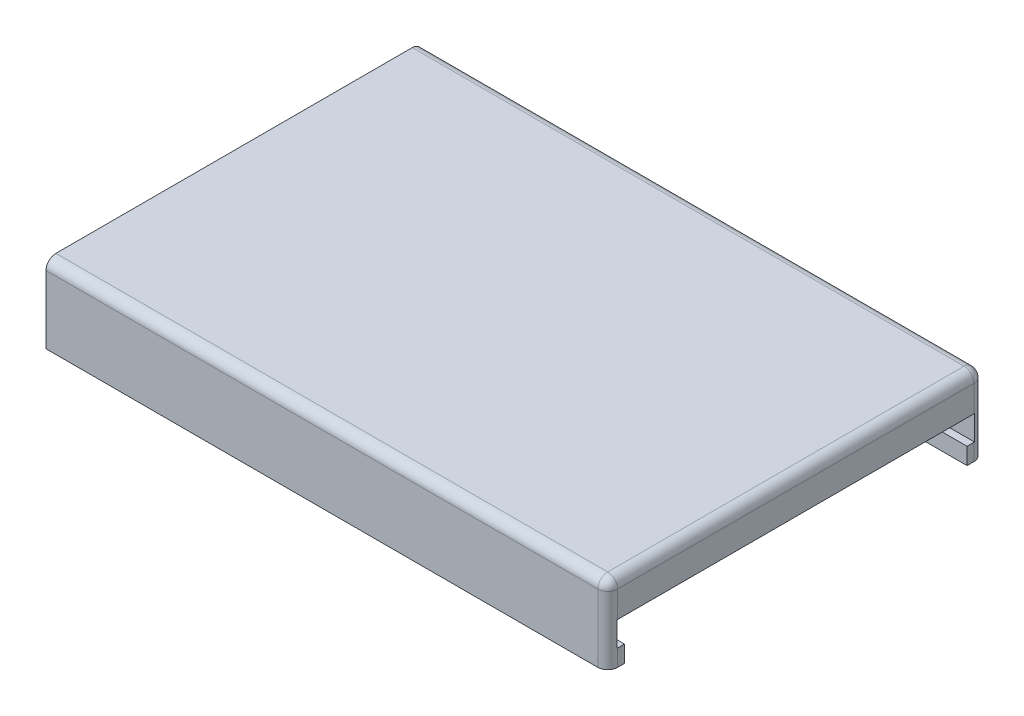
ISO-10303-21;
HEADER;
FILE_DESCRIPTION(('STEP AP214'),'2;1');
FILE_NAME('part.step','',(''),(''),'','','');
FILE_SCHEMA(('AUTOMOTIVE_DESIGN { 1 0 10303 214 1 1 1 1 }'));
ENDSEC;
DATA;
#1=APPLICATION_CONTEXT('core data for automotive mechanical design processes');
#2=APPLICATION_PROTOCOL_DEFINITION('international standard','automotive_design',2000,#1);
#3=PRODUCT_CONTEXT('',#1,'mechanical');
#4=PRODUCT('Part','Part','',(#3));
#5=PRODUCT_RELATED_PRODUCT_CATEGORY('part','',(#4));
#6=PRODUCT_DEFINITION_FORMATION('','',#4);
#7=PRODUCT_DEFINITION_CONTEXT('part definition',#1,'design');
#8=PRODUCT_DEFINITION('design','',#6,#7);
#9=PRODUCT_DEFINITION_SHAPE('','',#8);
#10=(LENGTH_UNIT() NAMED_UNIT(*) SI_UNIT(.MILLI.,.METRE.));
#11=(NAMED_UNIT(*) PLANE_ANGLE_UNIT() SI_UNIT($,.RADIAN.));
#12=(NAMED_UNIT(*) SI_UNIT($,.STERADIAN.) SOLID_ANGLE_UNIT());
#13=UNCERTAINTY_MEASURE_WITH_UNIT(LENGTH_MEASURE(1.E-05),#10,'distance_accuracy_value','');
#14=(GEOMETRIC_REPRESENTATION_CONTEXT(3) GLOBAL_UNCERTAINTY_ASSIGNED_CONTEXT((#13)) GLOBAL_UNIT_ASSIGNED_CONTEXT((#10,
#11,#12)) REPRESENTATION_CONTEXT('',''));
#15=CARTESIAN_POINT('',(0.,0.,0.));
#16=DIRECTION('',(0.,0.,1.));
#17=DIRECTION('',(1.,0.,0.));
#18=AXIS2_PLACEMENT_3D('',#15,#16,#17);
#19=CARTESIAN_POINT('',(28.448,3.937,-19.05));
#20=DIRECTION('',(-1.,0.,0.));
#21=DIRECTION('',(0.,0.,1.));
#22=AXIS2_PLACEMENT_3D('',#19,#20,#21);
#23=PLANE('',#22);
#24=DIRECTION('',(0.,0.,-1.));
#25=VECTOR('',#24,1.);
#26=CARTESIAN_POINT('',(28.448,-3.937,-19.05));
#27=LINE('',#26,#25);
#28=CARTESIAN_POINT('',(28.448,-3.937,-17.35));
#29=VERTEX_POINT('',#28);
#30=CARTESIAN_POINT('',(28.448,-3.937,-18.05));
#31=VERTEX_POINT('',#30);
#32=EDGE_CURVE('E254',#29,#31,#27,.T.);
#33=ORIENTED_EDGE('',*,*,#32,.T.);
#34=DIRECTION('',(0.,-1.,0.));
#35=VECTOR('',#34,1.);
#36=CARTESIAN_POINT('',(28.448,3.937,-18.05));
#37=LINE('',#36,#35);
#38=CARTESIAN_POINT('',(28.448,-2.237,-18.05));
#39=VERTEX_POINT('',#38);
#40=EDGE_CURVE('E307',#31,#39,#37,.F.);
#41=ORIENTED_EDGE('',*,*,#40,.T.);
#42=DIRECTION('',(0.,0.,-1.));
#43=VECTOR('',#42,1.);
#44=CARTESIAN_POINT('',(28.448,-2.237,-17.35));
#45=LINE('',#44,#43);
#46=CARTESIAN_POINT('',(28.448,-2.237,-17.35));
#47=VERTEX_POINT('',#46);
#48=EDGE_CURVE('E244',#47,#39,#45,.T.);
#49=ORIENTED_EDGE('',*,*,#48,.F.);
#50=DIRECTION('',(0.,1.,0.));
#51=VECTOR('',#50,1.);
#52=CARTESIAN_POINT('',(28.448,-2.237,-17.35));
#53=LINE('',#52,#51);
#54=EDGE_CURVE('E240',#29,#47,#53,.T.);
#55=ORIENTED_EDGE('',*,*,#54,.F.);
#56=EDGE_LOOP('',(#33,#41,#49,#55));
#57=FACE_BOUND('',#56,.T.);
#58=ADVANCED_FACE('F35',(#57),#23,.F.);
#59=DIRECTION('',(0.,0.,-1.));
#60=VECTOR('',#59,1.);
#61=CARTESIAN_POINT('',(28.448,-2.237,17.35));
#62=LINE('',#61,#60);
#63=CARTESIAN_POINT('',(28.448,-2.237,18.05));
#64=VERTEX_POINT('',#63);
#65=CARTESIAN_POINT('',(28.448,-2.237,17.35));
#66=VERTEX_POINT('',#65);
#67=EDGE_CURVE('E219',#64,#66,#62,.T.);
#68=ORIENTED_EDGE('',*,*,#67,.F.);
#69=DIRECTION('',(0.,-1.,0.));
#70=VECTOR('',#69,1.);
#71=CARTESIAN_POINT('',(28.448,3.937,18.05));
#72=LINE('',#71,#70);
#73=CARTESIAN_POINT('',(28.448,-3.937,18.05));
#74=VERTEX_POINT('',#73);
#75=EDGE_CURVE('E305',#64,#74,#72,.T.);
#76=ORIENTED_EDGE('',*,*,#75,.T.);
#77=CARTESIAN_POINT('',(28.448,-3.937,17.35));
#78=VERTEX_POINT('',#77);
#79=EDGE_CURVE('E278',#74,#78,#27,.T.);
#80=ORIENTED_EDGE('',*,*,#79,.T.);
#81=DIRECTION('',(0.,-1.,0.));
#82=VECTOR('',#81,1.);
#83=CARTESIAN_POINT('',(28.448,-2.237,17.35));
#84=LINE('',#83,#82);
#85=EDGE_CURVE('E237',#66,#78,#84,.T.);
#86=ORIENTED_EDGE('',*,*,#85,.F.);
#87=EDGE_LOOP('',(#68,#76,#80,#86));
#88=FACE_BOUND('',#87,.T.);
#89=ADVANCED_FACE('F454',(#88),#23,.F.);
#90=CARTESIAN_POINT('',(0.,-3.937,0.));
#91=DIRECTION('',(0.,1.,0.));
#92=DIRECTION('',(0.,0.,1.));
#93=AXIS2_PLACEMENT_3D('',#90,#91,#92);
#94=PLANE('',#93);
#95=ORIENTED_EDGE('',*,*,#79,.F.);
#96=CARTESIAN_POINT('',(27.448,-3.937,18.05));
#97=DIRECTION('',(0.,1.,0.));
#98=DIRECTION('',(0.,0.,1.));
#99=AXIS2_PLACEMENT_3D('',#96,#97,#98);
#100=CIRCLE('',#99,1.);
#101=CARTESIAN_POINT('',(27.448,-3.937,19.05));
#102=VERTEX_POINT('',#101);
#103=EDGE_CURVE('E321',#74,#102,#100,.F.);
#104=ORIENTED_EDGE('',*,*,#103,.T.);
#105=DIRECTION('',(1.,0.,0.));
#106=VECTOR('',#105,1.);
#107=CARTESIAN_POINT('',(-28.448,-3.937,19.05));
#108=LINE('',#107,#106);
#109=CARTESIAN_POINT('',(-28.448,-3.937,19.05));
#110=VERTEX_POINT('',#109);
#111=EDGE_CURVE('E277',#110,#102,#108,.T.);
#112=ORIENTED_EDGE('',*,*,#111,.F.);
#113=DIRECTION('',(0.,0.,1.));
#114=VECTOR('',#113,1.);
#115=CARTESIAN_POINT('',(-28.448,-3.937,-19.05));
#116=LINE('',#115,#114);
#117=CARTESIAN_POINT('',(-28.448,-3.937,17.35));
#118=VERTEX_POINT('',#117);
#119=EDGE_CURVE('E283',#118,#110,#116,.T.);
#120=ORIENTED_EDGE('',*,*,#119,.F.);
#121=DIRECTION('',(1.,0.,0.));
#122=VECTOR('',#121,1.);
#123=CARTESIAN_POINT('',(-28.448,-3.937,17.35));
#124=LINE('',#123,#122);
#125=EDGE_CURVE('E236',#118,#78,#124,.T.);
#126=ORIENTED_EDGE('',*,*,#125,.T.);
#127=EDGE_LOOP('',(#95,#104,#112,#120,#126));
#128=FACE_BOUND('',#127,.T.);
#129=ADVANCED_FACE('F377',(#128),#94,.F.);
#130=DIRECTION('',(0.,0.,1.));
#131=VECTOR('',#130,1.);
#132=CARTESIAN_POINT('',(28.448,0.263000000000001,17.4928360722236));
#133=LINE('',#132,#131);
#134=CARTESIAN_POINT('',(28.448,0.263000000000004,-18.05));
#135=VERTEX_POINT('',#134);
#136=CARTESIAN_POINT('',(28.448,0.263000000000001,18.05));
#137=VERTEX_POINT('',#136);
#138=EDGE_CURVE('E247',#135,#137,#133,.T.);
#139=ORIENTED_EDGE('',*,*,#138,.F.);
#140=DIRECTION('',(0.,-1.,0.));
#141=VECTOR('',#140,1.);
#142=CARTESIAN_POINT('',(28.448,3.937,-18.05));
#143=LINE('',#142,#141);
#144=CARTESIAN_POINT('',(28.448,2.937,-18.05));
#145=VERTEX_POINT('',#144);
#146=EDGE_CURVE('E303',#135,#145,#143,.F.);
#147=ORIENTED_EDGE('',*,*,#146,.T.);
#148=DIRECTION('',(0.,0.,-1.));
#149=VECTOR('',#148,1.);
#150=CARTESIAN_POINT('',(28.448,2.937,19.05));
#151=LINE('',#150,#149);
#152=CARTESIAN_POINT('',(28.448,2.937,18.05));
#153=VERTEX_POINT('',#152);
#154=EDGE_CURVE('E299',#145,#153,#151,.F.);
#155=ORIENTED_EDGE('',*,*,#154,.T.);
#156=DIRECTION('',(0.,-1.,0.));
#157=VECTOR('',#156,1.);
#158=CARTESIAN_POINT('',(28.448,3.937,18.05));
#159=LINE('',#158,#157);
#160=EDGE_CURVE('E301',#153,#137,#159,.T.);
#161=ORIENTED_EDGE('',*,*,#160,.T.);
#162=EDGE_LOOP('',(#139,#147,#155,#161));
#163=FACE_BOUND('',#162,.T.);
#164=ADVANCED_FACE('F457',(#163),#23,.F.);
#165=CARTESIAN_POINT('',(-28.448,3.937,-19.05));
#166=DIRECTION('',(0.,0.,1.));
#167=DIRECTION('',(1.,0.,0.));
#168=AXIS2_PLACEMENT_3D('',#165,#166,#167);
#169=PLANE('',#168);
#170=DIRECTION('',(-1.,0.,0.));
#171=VECTOR('',#170,1.);
#172=CARTESIAN_POINT('',(28.448,2.937,-19.05));
#173=LINE('',#172,#171);
#174=CARTESIAN_POINT('',(-28.448,2.937,-19.05));
#175=VERTEX_POINT('',#174);
#176=CARTESIAN_POINT('',(27.448,2.937,-19.05));
#177=VERTEX_POINT('',#176);
#178=EDGE_CURVE('E292',#175,#177,#173,.F.);
#179=ORIENTED_EDGE('',*,*,#178,.T.);
#180=DIRECTION('',(0.,-1.,0.));
#181=VECTOR('',#180,1.);
#182=CARTESIAN_POINT('',(27.448,3.937,-19.05));
#183=LINE('',#182,#181);
#184=CARTESIAN_POINT('',(27.448,-3.937,-19.05));
#185=VERTEX_POINT('',#184);
#186=EDGE_CURVE('E294',#177,#185,#183,.T.);
#187=ORIENTED_EDGE('',*,*,#186,.T.);
#188=DIRECTION('',(-1.,0.,0.));
#189=VECTOR('',#188,1.);
#190=CARTESIAN_POINT('',(-28.448,-3.937,-19.05));
#191=LINE('',#190,#189);
#192=CARTESIAN_POINT('',(-28.448,-3.937,-19.05));
#193=VERTEX_POINT('',#192);
#194=EDGE_CURVE('E280',#185,#193,#191,.T.);
#195=ORIENTED_EDGE('',*,*,#194,.T.);
#196=DIRECTION('',(0.,-1.,0.));
#197=VECTOR('',#196,1.);
#198=CARTESIAN_POINT('',(-28.448,3.937,-19.05));
#199=LINE('',#198,#197);
#200=EDGE_CURVE('E290',#175,#193,#199,.T.);
#201=ORIENTED_EDGE('',*,*,#200,.F.);
#202=EDGE_LOOP('',(#179,#187,#195,#201));
#203=FACE_BOUND('',#202,.T.);
#204=ADVANCED_FACE('F418',(#203),#169,.F.);
#205=CARTESIAN_POINT('',(-28.448,3.937,-19.05));
#206=DIRECTION('',(1.,0.,0.));
#207=DIRECTION('',(0.,0.,-1.));
#208=AXIS2_PLACEMENT_3D('',#205,#206,#207);
#209=PLANE('',#208);
#210=DIRECTION('',(0.,0.,1.));
#211=VECTOR('',#210,1.);
#212=CARTESIAN_POINT('',(-28.448,0.263000000000001,-17.4928360722236));
#213=LINE('',#212,#211);
#214=CARTESIAN_POINT('',(-28.448,0.263000000000001,-18.0975));
#215=VERTEX_POINT('',#214);
#216=CARTESIAN_POINT('',(-28.448,0.263000000000002,-17.35));
#217=VERTEX_POINT('',#216);
#218=EDGE_CURVE('E229',#215,#217,#213,.T.);
#219=ORIENTED_EDGE('',*,*,#218,.T.);
#220=DIRECTION('',(0.,-1.,0.));
#221=VECTOR('',#220,1.);
#222=CARTESIAN_POINT('',(-28.448,-2.237,-17.35));
#223=LINE('',#222,#221);
#224=CARTESIAN_POINT('',(-28.448,1.937,-17.35));
#225=VERTEX_POINT('',#224);
#226=EDGE_CURVE('E193',#225,#217,#223,.T.);
#227=ORIENTED_EDGE('',*,*,#226,.F.);
#228=DIRECTION('',(0.,0.,-1.));
#229=VECTOR('',#228,1.);
#230=CARTESIAN_POINT('',(-28.448,1.937,-17.35));
#231=LINE('',#230,#229);
#232=CARTESIAN_POINT('',(-28.448,1.937,17.4178867478934));
#233=VERTEX_POINT('',#232);
#234=EDGE_CURVE('E192',#233,#225,#231,.T.);
#235=ORIENTED_EDGE('',*,*,#234,.F.);
#236=DIRECTION('',(0.,1.,0.));
#237=VECTOR('',#236,1.);
#238=CARTESIAN_POINT('',(-28.448,-2.237,17.4178867478934));
#239=LINE('',#238,#237);
#240=CARTESIAN_POINT('',(-28.448,0.263000000000002,17.4178867478934));
#241=VERTEX_POINT('',#240);
#242=EDGE_CURVE('E184',#241,#233,#239,.T.);
#243=ORIENTED_EDGE('',*,*,#242,.F.);
#244=CARTESIAN_POINT('',(-28.448,0.263000000000001,18.0975));
#245=VERTEX_POINT('',#244);
#246=EDGE_CURVE('E228',#241,#245,#213,.T.);
#247=ORIENTED_EDGE('',*,*,#246,.T.);
#248=DIRECTION('',(0.,-1.,0.));
#249=VECTOR('',#248,1.);
#250=CARTESIAN_POINT('',(-28.448,-2.237,18.0975));
#251=LINE('',#250,#249);
#252=CARTESIAN_POINT('',(-28.448,-2.237,18.0975));
#253=VERTEX_POINT('',#252);
#254=EDGE_CURVE('E231',#245,#253,#251,.T.);
#255=ORIENTED_EDGE('',*,*,#254,.T.);
#256=DIRECTION('',(0.,0.,-1.));
#257=VECTOR('',#256,1.);
#258=CARTESIAN_POINT('',(-28.448,-2.237,17.35));
#259=LINE('',#258,#257);
#260=CARTESIAN_POINT('',(-28.448,-2.237,17.35));
#261=VERTEX_POINT('',#260);
#262=EDGE_CURVE('E234',#253,#261,#259,.T.);
#263=ORIENTED_EDGE('',*,*,#262,.T.);
#264=DIRECTION('',(0.,-1.,0.));
#265=VECTOR('',#264,1.);
#266=CARTESIAN_POINT('',(-28.448,-2.237,17.35));
#267=LINE('',#266,#265);
#268=EDGE_CURVE('E215',#261,#118,#267,.T.);
#269=ORIENTED_EDGE('',*,*,#268,.T.);
#270=ORIENTED_EDGE('',*,*,#119,.T.);
#271=DIRECTION('',(0.,-1.,0.));
#272=VECTOR('',#271,1.);
#273=CARTESIAN_POINT('',(-28.448,3.937,19.05));
#274=LINE('',#273,#272);
#275=CARTESIAN_POINT('',(-28.448,2.937,19.05));
#276=VERTEX_POINT('',#275);
#277=EDGE_CURVE('E276',#276,#110,#274,.T.);
#278=ORIENTED_EDGE('',*,*,#277,.F.);
#279=CARTESIAN_POINT('',(-28.448,2.937,18.05));
#280=DIRECTION('',(1.,0.,0.));
#281=DIRECTION('',(0.,0.,-1.));
#282=AXIS2_PLACEMENT_3D('',#279,#280,#281);
#283=CIRCLE('',#282,1.);
#284=CARTESIAN_POINT('',(-28.448,3.937,18.05));
#285=VERTEX_POINT('',#284);
#286=EDGE_CURVE('E332',#276,#285,#283,.F.);
#287=ORIENTED_EDGE('',*,*,#286,.T.);
#288=DIRECTION('',(0.,0.,1.));
#289=VECTOR('',#288,1.);
#290=CARTESIAN_POINT('',(-28.448,3.937,-19.05));
#291=LINE('',#290,#289);
#292=CARTESIAN_POINT('',(-28.448,3.937,-18.05));
#293=VERTEX_POINT('',#292);
#294=EDGE_CURVE('E273',#293,#285,#291,.T.);
#295=ORIENTED_EDGE('',*,*,#294,.F.);
#296=CARTESIAN_POINT('',(-28.448,2.937,-18.05));
#297=DIRECTION('',(1.,0.,0.));
#298=DIRECTION('',(0.,0.,-1.));
#299=AXIS2_PLACEMENT_3D('',#296,#297,#298);
#300=CIRCLE('',#299,1.);
#301=EDGE_CURVE('E334',#293,#175,#300,.F.);
#302=ORIENTED_EDGE('',*,*,#301,.T.);
#303=ORIENTED_EDGE('',*,*,#200,.T.);
#304=CARTESIAN_POINT('',(-28.448,-3.937,-17.35));
#305=VERTEX_POINT('',#304);
#306=EDGE_CURVE('E284',#193,#305,#116,.T.);
#307=ORIENTED_EDGE('',*,*,#306,.T.);
#308=DIRECTION('',(0.,1.,0.));
#309=VECTOR('',#308,1.);
#310=CARTESIAN_POINT('',(-28.448,-2.237,-17.35));
#311=LINE('',#310,#309);
#312=CARTESIAN_POINT('',(-28.448,-2.237,-17.35));
#313=VERTEX_POINT('',#312);
#314=EDGE_CURVE('E218',#305,#313,#311,.T.);
#315=ORIENTED_EDGE('',*,*,#314,.T.);
#316=DIRECTION('',(0.,0.,-1.));
#317=VECTOR('',#316,1.);
#318=CARTESIAN_POINT('',(-28.448,-2.237,-17.35));
#319=LINE('',#318,#317);
#320=CARTESIAN_POINT('',(-28.448,-2.237,-18.0975));
#321=VERTEX_POINT('',#320);
#322=EDGE_CURVE('E222',#313,#321,#319,.T.);
#323=ORIENTED_EDGE('',*,*,#322,.T.);
#324=DIRECTION('',(0.,1.,0.));
#325=VECTOR('',#324,1.);
#326=CARTESIAN_POINT('',(-28.448,-2.237,-18.0975));
#327=LINE('',#326,#325);
#328=EDGE_CURVE('E225',#321,#215,#327,.T.);
#329=ORIENTED_EDGE('',*,*,#328,.T.);
#330=EDGE_LOOP('',(#219,#227,#235,#243,#247,#255,#263,#269,#270,#278,#287,#295,#302,#303,#307,
#315,#323,#329));
#331=FACE_BOUND('',#330,.T.);
#332=ADVANCED_FACE('F205',(#331),#209,.F.);
#333=CARTESIAN_POINT('',(-28.448,3.937,19.05));
#334=DIRECTION('',(0.,0.,-1.));
#335=DIRECTION('',(-1.,0.,0.));
#336=AXIS2_PLACEMENT_3D('',#333,#334,#335);
#337=PLANE('',#336);
#338=ORIENTED_EDGE('',*,*,#111,.T.);
#339=DIRECTION('',(0.,-1.,0.));
#340=VECTOR('',#339,1.);
#341=CARTESIAN_POINT('',(27.448,3.937,19.05));
#342=LINE('',#341,#340);
#343=CARTESIAN_POINT('',(27.448,2.937,19.05));
#344=VERTEX_POINT('',#343);
#345=EDGE_CURVE('E325',#102,#344,#342,.F.);
#346=ORIENTED_EDGE('',*,*,#345,.T.);
#347=DIRECTION('',(1.,0.,0.));
#348=VECTOR('',#347,1.);
#349=CARTESIAN_POINT('',(-28.448,2.937,19.05));
#350=LINE('',#349,#348);
#351=EDGE_CURVE('E323',#344,#276,#350,.F.);
#352=ORIENTED_EDGE('',*,*,#351,.T.);
#353=ORIENTED_EDGE('',*,*,#277,.T.);
#354=EDGE_LOOP('',(#338,#346,#352,#353));
#355=FACE_BOUND('',#354,.T.);
#356=ADVANCED_FACE('F381',(#355),#337,.F.);
#357=CARTESIAN_POINT('',(0.,3.937,0.));
#358=DIRECTION('',(0.,1.,0.));
#359=DIRECTION('',(0.,0.,1.));
#360=AXIS2_PLACEMENT_3D('',#357,#358,#359);
#361=PLANE('',#360);
#362=DIRECTION('',(0.,0.,-1.));
#363=VECTOR('',#362,1.);
#364=CARTESIAN_POINT('',(27.448,3.937,-19.05));
#365=LINE('',#364,#363);
#366=CARTESIAN_POINT('',(27.448,3.937,18.05));
#367=VERTEX_POINT('',#366);
#368=CARTESIAN_POINT('',(27.448,3.937,-18.05));
#369=VERTEX_POINT('',#368);
#370=EDGE_CURVE('E58',#367,#369,#365,.T.);
#371=ORIENTED_EDGE('',*,*,#370,.T.);
#372=DIRECTION('',(-1.,0.,0.));
#373=VECTOR('',#372,1.);
#374=CARTESIAN_POINT('',(-28.448,3.937,-18.05));
#375=LINE('',#374,#373);
#376=EDGE_CURVE('E330',#369,#293,#375,.T.);
#377=ORIENTED_EDGE('',*,*,#376,.T.);
#378=ORIENTED_EDGE('',*,*,#294,.T.);
#379=DIRECTION('',(1.,0.,0.));
#380=VECTOR('',#379,1.);
#381=CARTESIAN_POINT('',(28.448,3.937,18.05));
#382=LINE('',#381,#380);
#383=EDGE_CURVE('E327',#285,#367,#382,.T.);
#384=ORIENTED_EDGE('',*,*,#383,.T.);
#385=EDGE_LOOP('',(#371,#377,#378,#384));
#386=FACE_BOUND('',#385,.T.);
#387=ADVANCED_FACE('F398',(#386),#361,.T.);
#388=ORIENTED_EDGE('',*,*,#194,.F.);
#389=CARTESIAN_POINT('',(27.448,-3.937,-18.05));
#390=DIRECTION('',(0.,1.,0.));
#391=DIRECTION('',(0.,0.,1.));
#392=AXIS2_PLACEMENT_3D('',#389,#390,#391);
#393=CIRCLE('',#392,1.);
#394=EDGE_CURVE('E297',#185,#31,#393,.F.);
#395=ORIENTED_EDGE('',*,*,#394,.T.);
#396=ORIENTED_EDGE('',*,*,#32,.F.);
#397=DIRECTION('',(1.,0.,0.));
#398=VECTOR('',#397,1.);
#399=CARTESIAN_POINT('',(-28.448,-3.937,-17.35));
#400=LINE('',#399,#398);
#401=EDGE_CURVE('E269',#305,#29,#400,.T.);
#402=ORIENTED_EDGE('',*,*,#401,.F.);
#403=ORIENTED_EDGE('',*,*,#306,.F.);
#404=EDGE_LOOP('',(#388,#395,#396,#402,#403));
#405=FACE_BOUND('',#404,.T.);
#406=ADVANCED_FACE('F422',(#405),#94,.F.);
#407=CARTESIAN_POINT('',(-28.448,-2.237,17.35));
#408=DIRECTION('',(0.,0.,1.));
#409=DIRECTION('',(1.,0.,0.));
#410=AXIS2_PLACEMENT_3D('',#407,#408,#409);
#411=PLANE('',#410);
#412=ORIENTED_EDGE('',*,*,#85,.T.);
#413=ORIENTED_EDGE('',*,*,#125,.F.);
#414=ORIENTED_EDGE('',*,*,#268,.F.);
#415=DIRECTION('',(1.,0.,0.));
#416=VECTOR('',#415,1.);
#417=CARTESIAN_POINT('',(-28.448,-2.237,17.35));
#418=LINE('',#417,#416);
#419=EDGE_CURVE('E252',#261,#66,#418,.T.);
#420=ORIENTED_EDGE('',*,*,#419,.T.);
#421=EDGE_LOOP('',(#412,#413,#414,#420));
#422=FACE_BOUND('',#421,.T.);
#423=ADVANCED_FACE('F370',(#422),#411,.F.);
#424=CARTESIAN_POINT('',(-28.448,-2.237,17.35));
#425=DIRECTION('',(0.,-1.,0.));
#426=DIRECTION('',(0.,0.,-1.));
#427=AXIS2_PLACEMENT_3D('',#424,#425,#426);
#428=PLANE('',#427);
#429=ORIENTED_EDGE('',*,*,#419,.F.);
#430=ORIENTED_EDGE('',*,*,#262,.F.);
#431=DIRECTION('',(1.,0.,0.));
#432=VECTOR('',#431,1.);
#433=CARTESIAN_POINT('',(-28.448,-2.237,18.0975));
#434=LINE('',#433,#432);
#435=CARTESIAN_POINT('',(28.4468712379481,-2.237,18.0975));
#436=VERTEX_POINT('',#435);
#437=EDGE_CURVE('E255',#253,#436,#434,.T.);
#438=ORIENTED_EDGE('',*,*,#437,.T.);
#439=CARTESIAN_POINT('',(27.448,-2.237,18.05));
#440=DIRECTION('',(0.,-1.,0.));
#441=DIRECTION('',(0.,0.,-1.));
#442=AXIS2_PLACEMENT_3D('',#439,#440,#441);
#443=CIRCLE('',#442,1.);
#444=EDGE_CURVE('E319',#436,#64,#443,.F.);
#445=ORIENTED_EDGE('',*,*,#444,.T.);
#446=ORIENTED_EDGE('',*,*,#67,.T.);
#447=EDGE_LOOP('',(#429,#430,#438,#445,#446));
#448=FACE_BOUND('',#447,.T.);
#449=ADVANCED_FACE('F365',(#448),#428,.F.);
#450=CARTESIAN_POINT('',(-28.448,-2.237,18.0975));
#451=DIRECTION('',(0.,0.,1.));
#452=DIRECTION('',(1.,0.,0.));
#453=AXIS2_PLACEMENT_3D('',#450,#451,#452);
#454=PLANE('',#453);
#455=DIRECTION('',(1.,0.,0.));
#456=VECTOR('',#455,1.);
#457=CARTESIAN_POINT('',(-28.448,0.263000000000001,18.0975));
#458=LINE('',#457,#456);
#459=CARTESIAN_POINT('',(28.4468712379481,0.263000000000001,18.0975));
#460=VERTEX_POINT('',#459);
#461=EDGE_CURVE('E258',#245,#460,#458,.T.);
#462=ORIENTED_EDGE('',*,*,#461,.T.);
#463=DIRECTION('',(0.,-1.,0.));
#464=VECTOR('',#463,1.);
#465=CARTESIAN_POINT('',(28.4468712379481,0.263000000000001,18.0975));
#466=LINE('',#465,#464);
#467=EDGE_CURVE('E317',#460,#436,#466,.T.);
#468=ORIENTED_EDGE('',*,*,#467,.T.);
#469=ORIENTED_EDGE('',*,*,#437,.F.);
#470=ORIENTED_EDGE('',*,*,#254,.F.);
#471=EDGE_LOOP('',(#462,#468,#469,#470));
#472=FACE_BOUND('',#471,.T.);
#473=ADVANCED_FACE('F361',(#472),#454,.F.);
#474=CARTESIAN_POINT('',(-28.448,0.263000000000001,17.4928360722236));
#475=DIRECTION('',(0.,1.,0.));
#476=DIRECTION('',(0.,0.,1.));
#477=AXIS2_PLACEMENT_3D('',#474,#475,#476);
#478=PLANE('',#477);
#479=DIRECTION('',(0.,0.,1.));
#480=VECTOR('',#479,1.);
#481=CARTESIAN_POINT('',(26.448,0.263000000000001,17.4928360722236));
#482=LINE('',#481,#480);
#483=CARTESIAN_POINT('',(26.448,0.263000000000004,-17.35));
#484=VERTEX_POINT('',#483);
#485=CARTESIAN_POINT('',(26.448,0.263000000000002,17.4178867478933));
#486=VERTEX_POINT('',#485);
#487=EDGE_CURVE('E43',#484,#486,#482,.T.);
#488=ORIENTED_EDGE('',*,*,#487,.F.);
#489=DIRECTION('',(-1.,0.,0.));
#490=VECTOR('',#489,1.);
#491=CARTESIAN_POINT('',(-28.448,0.263000000000004,-17.35));
#492=LINE('',#491,#490);
#493=EDGE_CURVE('E211',#484,#217,#492,.T.);
#494=ORIENTED_EDGE('',*,*,#493,.T.);
#495=ORIENTED_EDGE('',*,*,#218,.F.);
#496=DIRECTION('',(1.,0.,0.));
#497=VECTOR('',#496,1.);
#498=CARTESIAN_POINT('',(-28.448,0.263000000000001,-18.0975));
#499=LINE('',#498,#497);
#500=CARTESIAN_POINT('',(28.4468712379481,0.263000000000004,-18.0975));
#501=VERTEX_POINT('',#500);
#502=EDGE_CURVE('E261',#215,#501,#499,.T.);
#503=ORIENTED_EDGE('',*,*,#502,.T.);
#504=CARTESIAN_POINT('',(27.448,0.263000000000004,-18.05));
#505=DIRECTION('',(0.,1.,0.));
#506=DIRECTION('',(0.,0.,1.));
#507=AXIS2_PLACEMENT_3D('',#504,#505,#506);
#508=CIRCLE('',#507,1.);
#509=EDGE_CURVE('E315',#501,#135,#508,.F.);
#510=ORIENTED_EDGE('',*,*,#509,.T.);
#511=ORIENTED_EDGE('',*,*,#138,.T.);
#512=CARTESIAN_POINT('',(27.448,0.263000000000001,18.05));
#513=DIRECTION('',(0.,1.,0.));
#514=DIRECTION('',(0.,0.,1.));
#515=AXIS2_PLACEMENT_3D('',#512,#513,#514);
#516=CIRCLE('',#515,1.);
#517=EDGE_CURVE('E313',#137,#460,#516,.F.);
#518=ORIENTED_EDGE('',*,*,#517,.T.);
#519=ORIENTED_EDGE('',*,*,#461,.F.);
#520=ORIENTED_EDGE('',*,*,#246,.F.);
#521=DIRECTION('',(1.,0.,0.));
#522=VECTOR('',#521,1.);
#523=CARTESIAN_POINT('',(-28.448,0.263000000000001,17.4178867478934));
#524=LINE('',#523,#522);
#525=EDGE_CURVE('E12',#241,#486,#524,.T.);
#526=ORIENTED_EDGE('',*,*,#525,.T.);
#527=EDGE_LOOP('',(#488,#494,#495,#503,#510,#511,#518,#519,#520,#526));
#528=FACE_BOUND('',#527,.T.);
#529=ADVANCED_FACE('F355',(#528),#478,.F.);
#530=CARTESIAN_POINT('',(-28.448,-2.237,-18.0975));
#531=DIRECTION('',(0.,0.,-1.));
#532=DIRECTION('',(-1.,0.,0.));
#533=AXIS2_PLACEMENT_3D('',#530,#531,#532);
#534=PLANE('',#533);
#535=DIRECTION('',(1.,0.,0.));
#536=VECTOR('',#535,1.);
#537=CARTESIAN_POINT('',(-28.448,-2.237,-18.0975));
#538=LINE('',#537,#536);
#539=CARTESIAN_POINT('',(28.4468712379481,-2.237,-18.0975));
#540=VERTEX_POINT('',#539);
#541=EDGE_CURVE('E264',#321,#540,#538,.T.);
#542=ORIENTED_EDGE('',*,*,#541,.T.);
#543=DIRECTION('',(0.,-1.,0.));
#544=VECTOR('',#543,1.);
#545=CARTESIAN_POINT('',(28.4468712379481,-2.237,-18.0975));
#546=LINE('',#545,#544);
#547=EDGE_CURVE('E311',#540,#501,#546,.F.);
#548=ORIENTED_EDGE('',*,*,#547,.T.);
#549=ORIENTED_EDGE('',*,*,#502,.F.);
#550=ORIENTED_EDGE('',*,*,#328,.F.);
#551=EDGE_LOOP('',(#542,#548,#549,#550));
#552=FACE_BOUND('',#551,.T.);
#553=ADVANCED_FACE('F436',(#552),#534,.F.);
#554=CARTESIAN_POINT('',(-28.448,-2.237,-17.35));
#555=DIRECTION('',(0.,-1.,0.));
#556=DIRECTION('',(0.,0.,-1.));
#557=AXIS2_PLACEMENT_3D('',#554,#555,#556);
#558=PLANE('',#557);
#559=ORIENTED_EDGE('',*,*,#48,.T.);
#560=CARTESIAN_POINT('',(27.448,-2.237,-18.05));
#561=DIRECTION('',(0.,-1.,0.));
#562=DIRECTION('',(0.,0.,-1.));
#563=AXIS2_PLACEMENT_3D('',#560,#561,#562);
#564=CIRCLE('',#563,1.);
#565=EDGE_CURVE('E309',#39,#540,#564,.F.);
#566=ORIENTED_EDGE('',*,*,#565,.T.);
#567=ORIENTED_EDGE('',*,*,#541,.F.);
#568=ORIENTED_EDGE('',*,*,#322,.F.);
#569=DIRECTION('',(1.,0.,0.));
#570=VECTOR('',#569,1.);
#571=CARTESIAN_POINT('',(-28.448,-2.237,-17.35));
#572=LINE('',#571,#570);
#573=EDGE_CURVE('E267',#313,#47,#572,.T.);
#574=ORIENTED_EDGE('',*,*,#573,.T.);
#575=EDGE_LOOP('',(#559,#566,#567,#568,#574));
#576=FACE_BOUND('',#575,.T.);
#577=ADVANCED_FACE('F432',(#576),#558,.F.);
#578=CARTESIAN_POINT('',(-28.448,-2.237,-17.35));
#579=DIRECTION('',(0.,0.,-1.));
#580=DIRECTION('',(-1.,0.,0.));
#581=AXIS2_PLACEMENT_3D('',#578,#579,#580);
#582=PLANE('',#581);
#583=ORIENTED_EDGE('',*,*,#54,.T.);
#584=ORIENTED_EDGE('',*,*,#573,.F.);
#585=ORIENTED_EDGE('',*,*,#314,.F.);
#586=ORIENTED_EDGE('',*,*,#401,.T.);
#587=EDGE_LOOP('',(#583,#584,#585,#586));
#588=FACE_BOUND('',#587,.T.);
#589=ADVANCED_FACE('F428',(#588),#582,.F.);
#590=CARTESIAN_POINT('',(27.448,3.937,18.05));
#591=DIRECTION('',(0.,-1.,0.));
#592=DIRECTION('',(0.,0.,-1.));
#593=AXIS2_PLACEMENT_3D('',#590,#591,#592);
#594=CYLINDRICAL_SURFACE('',#593,1.);
#595=ORIENTED_EDGE('',*,*,#517,.F.);
#596=ORIENTED_EDGE('',*,*,#160,.F.);
#597=CARTESIAN_POINT('',(27.448,2.937,18.05));
#598=DIRECTION('',(0.,1.,0.));
#599=DIRECTION('',(0.,0.,1.));
#600=AXIS2_PLACEMENT_3D('',#597,#598,#599);
#601=CIRCLE('',#600,1.);
#602=EDGE_CURVE('E241',#344,#153,#601,.T.);
#603=ORIENTED_EDGE('',*,*,#602,.F.);
#604=ORIENTED_EDGE('',*,*,#345,.F.);
#605=ORIENTED_EDGE('',*,*,#103,.F.);
#606=ORIENTED_EDGE('',*,*,#75,.F.);
#607=ORIENTED_EDGE('',*,*,#444,.F.);
#608=ORIENTED_EDGE('',*,*,#467,.F.);
#609=EDGE_LOOP('',(#595,#596,#603,#604,#605,#606,#607,#608));
#610=FACE_BOUND('',#609,.T.);
#611=ADVANCED_FACE('F37',(#610),#594,.T.);
#612=CARTESIAN_POINT('',(0.,2.937,18.05));
#613=DIRECTION('',(-1.,0.,0.));
#614=DIRECTION('',(0.,0.,1.));
#615=AXIS2_PLACEMENT_3D('',#612,#613,#614);
#616=CYLINDRICAL_SURFACE('',#615,1.);
#617=ORIENTED_EDGE('',*,*,#286,.F.);
#618=ORIENTED_EDGE('',*,*,#351,.F.);
#619=CARTESIAN_POINT('',(27.448,2.937,18.05));
#620=DIRECTION('',(1.,0.,0.));
#621=DIRECTION('',(0.,0.,-1.));
#622=AXIS2_PLACEMENT_3D('',#619,#620,#621);
#623=CIRCLE('',#622,1.);
#624=EDGE_CURVE('E347',#367,#344,#623,.T.);
#625=ORIENTED_EDGE('',*,*,#624,.F.);
#626=ORIENTED_EDGE('',*,*,#383,.F.);
#627=EDGE_LOOP('',(#617,#618,#625,#626));
#628=FACE_BOUND('',#627,.T.);
#629=ADVANCED_FACE('F395',(#628),#616,.T.);
#630=CARTESIAN_POINT('',(27.448,2.937,18.05));
#631=DIRECTION('',(0.,0.,1.));
#632=DIRECTION('',(1.,0.,0.));
#633=AXIS2_PLACEMENT_3D('',#630,#631,#632);
#634=SPHERICAL_SURFACE('',#633,1.);
#635=ORIENTED_EDGE('',*,*,#624,.T.);
#636=ORIENTED_EDGE('',*,*,#602,.T.);
#637=CARTESIAN_POINT('',(27.448,2.937,18.05));
#638=DIRECTION('',(0.,0.,1.));
#639=DIRECTION('',(1.,0.,0.));
#640=AXIS2_PLACEMENT_3D('',#637,#638,#639);
#641=CIRCLE('',#640,1.);
#642=EDGE_CURVE('E344',#367,#153,#641,.F.);
#643=ORIENTED_EDGE('',*,*,#642,.F.);
#644=EDGE_LOOP('',(#635,#636,#643));
#645=FACE_BOUND('',#644,.T.);
#646=ADVANCED_FACE('F391',(#645),#634,.T.);
#647=CARTESIAN_POINT('',(27.448,2.937,0.));
#648=DIRECTION('',(0.,0.,1.));
#649=DIRECTION('',(1.,0.,0.));
#650=AXIS2_PLACEMENT_3D('',#647,#648,#649);
#651=CYLINDRICAL_SURFACE('',#650,1.);
#652=ORIENTED_EDGE('',*,*,#642,.T.);
#653=ORIENTED_EDGE('',*,*,#154,.F.);
#654=CARTESIAN_POINT('',(27.448,2.937,-18.05));
#655=DIRECTION('',(0.,0.,-1.));
#656=DIRECTION('',(-1.,0.,0.));
#657=AXIS2_PLACEMENT_3D('',#654,#655,#656);
#658=CIRCLE('',#657,1.);
#659=EDGE_CURVE('E341',#369,#145,#658,.T.);
#660=ORIENTED_EDGE('',*,*,#659,.F.);
#661=ORIENTED_EDGE('',*,*,#370,.F.);
#662=EDGE_LOOP('',(#652,#653,#660,#661));
#663=FACE_BOUND('',#662,.T.);
#664=ADVANCED_FACE('F407',(#663),#651,.T.);
#665=CARTESIAN_POINT('',(0.,2.937,-18.05));
#666=DIRECTION('',(1.,0.,0.));
#667=DIRECTION('',(0.,0.,-1.));
#668=AXIS2_PLACEMENT_3D('',#665,#666,#667);
#669=CYLINDRICAL_SURFACE('',#668,1.);
#670=ORIENTED_EDGE('',*,*,#301,.F.);
#671=ORIENTED_EDGE('',*,*,#376,.F.);
#672=CARTESIAN_POINT('',(27.448,2.937,-18.05));
#673=DIRECTION('',(1.,0.,0.));
#674=DIRECTION('',(0.,0.,-1.));
#675=AXIS2_PLACEMENT_3D('',#672,#673,#674);
#676=CIRCLE('',#675,1.);
#677=EDGE_CURVE('E338',#177,#369,#676,.T.);
#678=ORIENTED_EDGE('',*,*,#677,.F.);
#679=ORIENTED_EDGE('',*,*,#178,.F.);
#680=EDGE_LOOP('',(#670,#671,#678,#679));
#681=FACE_BOUND('',#680,.T.);
#682=ADVANCED_FACE('F402',(#681),#669,.T.);
#683=CARTESIAN_POINT('',(27.448,2.937,-18.05));
#684=DIRECTION('',(0.,0.,1.));
#685=DIRECTION('',(1.,0.,0.));
#686=AXIS2_PLACEMENT_3D('',#683,#684,#685);
#687=SPHERICAL_SURFACE('',#686,1.);
#688=ORIENTED_EDGE('',*,*,#677,.T.);
#689=ORIENTED_EDGE('',*,*,#659,.T.);
#690=CARTESIAN_POINT('',(27.448,2.937,-18.05));
#691=DIRECTION('',(0.,1.,0.));
#692=DIRECTION('',(0.,0.,1.));
#693=AXIS2_PLACEMENT_3D('',#690,#691,#692);
#694=CIRCLE('',#693,1.);
#695=EDGE_CURVE('E214',#177,#145,#694,.F.);
#696=ORIENTED_EDGE('',*,*,#695,.F.);
#697=EDGE_LOOP('',(#688,#689,#696));
#698=FACE_BOUND('',#697,.T.);
#699=ADVANCED_FACE('F409',(#698),#687,.T.);
#700=CARTESIAN_POINT('',(27.448,3.937,-18.05));
#701=DIRECTION('',(0.,-1.,0.));
#702=DIRECTION('',(0.,0.,-1.));
#703=AXIS2_PLACEMENT_3D('',#700,#701,#702);
#704=CYLINDRICAL_SURFACE('',#703,1.);
#705=ORIENTED_EDGE('',*,*,#565,.F.);
#706=ORIENTED_EDGE('',*,*,#40,.F.);
#707=ORIENTED_EDGE('',*,*,#394,.F.);
#708=ORIENTED_EDGE('',*,*,#186,.F.);
#709=ORIENTED_EDGE('',*,*,#695,.T.);
#710=ORIENTED_EDGE('',*,*,#146,.F.);
#711=ORIENTED_EDGE('',*,*,#509,.F.);
#712=ORIENTED_EDGE('',*,*,#547,.F.);
#713=EDGE_LOOP('',(#705,#706,#707,#708,#709,#710,#711,#712));
#714=FACE_BOUND('',#713,.T.);
#715=ADVANCED_FACE('F414',(#714),#704,.T.);
#716=CARTESIAN_POINT('',(63.4655416743429,-2.237,17.4178867478933));
#717=DIRECTION('',(0.,0.,1.));
#718=DIRECTION('',(1.,0.,0.));
#719=AXIS2_PLACEMENT_3D('',#716,#717,#718);
#720=PLANE('',#719);
#721=ORIENTED_EDGE('',*,*,#242,.T.);
#722=DIRECTION('',(-1.,0.,0.));
#723=VECTOR('',#722,1.);
#724=CARTESIAN_POINT('',(63.4655416743429,1.937,17.4178867478933));
#725=LINE('',#724,#723);
#726=CARTESIAN_POINT('',(26.448,1.937,17.4178867478933));
#727=VERTEX_POINT('',#726);
#728=EDGE_CURVE('E188',#727,#233,#725,.T.);
#729=ORIENTED_EDGE('',*,*,#728,.F.);
#730=DIRECTION('',(0.,-1.,0.));
#731=VECTOR('',#730,1.);
#732=CARTESIAN_POINT('',(26.448,-2.237,17.4178867478933));
#733=LINE('',#732,#731);
#734=EDGE_CURVE('E209',#727,#486,#733,.T.);
#735=ORIENTED_EDGE('',*,*,#734,.T.);
#736=ORIENTED_EDGE('',*,*,#525,.F.);
#737=EDGE_LOOP('',(#721,#729,#735,#736));
#738=FACE_BOUND('',#737,.T.);
#739=ADVANCED_FACE('F186',(#738),#720,.F.);
#740=CARTESIAN_POINT('',(26.448,3.937,-19.05));
#741=DIRECTION('',(-1.,0.,0.));
#742=DIRECTION('',(0.,0.,1.));
#743=AXIS2_PLACEMENT_3D('',#740,#741,#742);
#744=PLANE('',#743);
#745=ORIENTED_EDGE('',*,*,#487,.T.);
#746=ORIENTED_EDGE('',*,*,#734,.F.);
#747=DIRECTION('',(0.,0.,1.));
#748=VECTOR('',#747,1.);
#749=CARTESIAN_POINT('',(26.448,1.937,-17.35));
#750=LINE('',#749,#748);
#751=CARTESIAN_POINT('',(26.448,1.937,-17.35));
#752=VERTEX_POINT('',#751);
#753=EDGE_CURVE('E200',#752,#727,#750,.T.);
#754=ORIENTED_EDGE('',*,*,#753,.F.);
#755=DIRECTION('',(0.,1.,0.));
#756=VECTOR('',#755,1.);
#757=CARTESIAN_POINT('',(26.448,-2.237,-17.35));
#758=LINE('',#757,#756);
#759=EDGE_CURVE('E50',#484,#752,#758,.T.);
#760=ORIENTED_EDGE('',*,*,#759,.F.);
#761=EDGE_LOOP('',(#745,#746,#754,#760));
#762=FACE_BOUND('',#761,.T.);
#763=ADVANCED_FACE('F352',(#762),#744,.T.);
#764=CARTESIAN_POINT('',(63.4655416743429,-2.237,-17.35));
#765=DIRECTION('',(0.,0.,-1.));
#766=DIRECTION('',(-1.,0.,0.));
#767=AXIS2_PLACEMENT_3D('',#764,#765,#766);
#768=PLANE('',#767);
#769=ORIENTED_EDGE('',*,*,#759,.T.);
#770=DIRECTION('',(-1.,0.,0.));
#771=VECTOR('',#770,1.);
#772=CARTESIAN_POINT('',(63.4655416743429,1.937,-17.35));
#773=LINE('',#772,#771);
#774=EDGE_CURVE('E202',#752,#225,#773,.T.);
#775=ORIENTED_EDGE('',*,*,#774,.T.);
#776=ORIENTED_EDGE('',*,*,#226,.T.);
#777=ORIENTED_EDGE('',*,*,#493,.F.);
#778=EDGE_LOOP('',(#769,#775,#776,#777));
#779=FACE_BOUND('',#778,.T.);
#780=ADVANCED_FACE('F440',(#779),#768,.F.);
#781=CARTESIAN_POINT('',(63.4655416743429,1.937,-17.35));
#782=DIRECTION('',(0.,1.,0.));
#783=DIRECTION('',(0.,0.,1.));
#784=AXIS2_PLACEMENT_3D('',#781,#782,#783);
#785=PLANE('',#784);
#786=ORIENTED_EDGE('',*,*,#753,.T.);
#787=ORIENTED_EDGE('',*,*,#728,.T.);
#788=ORIENTED_EDGE('',*,*,#234,.T.);
#789=ORIENTED_EDGE('',*,*,#774,.F.);
#790=EDGE_LOOP('',(#786,#787,#788,#789));
#791=FACE_BOUND('',#790,.T.);
#792=ADVANCED_FACE('F197',(#791),#785,.F.);
#793=CLOSED_SHELL('',(#58,#89,#129,#164,#204,#332,#356,#387,#406,#423,#449,#473,#529,#553,#577,
#589,#611,#629,#646,#664,#682,#699,#715,#739,#763,#780,#792));
#794=MANIFOLD_SOLID_BREP('B2',#793);
#795=ADVANCED_BREP_SHAPE_REPRESENTATION('',(#18,#794),#14);
#796=SHAPE_DEFINITION_REPRESENTATION(#9,#795);
ENDSEC;
END-ISO-10303-21;
